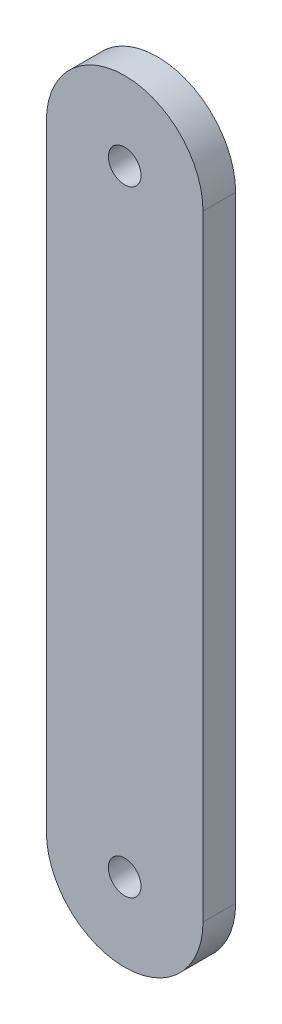
ISO-10303-21;
HEADER;
FILE_DESCRIPTION(('STEP AP214'),'2;1');
FILE_NAME('part.step','',(''),(''),'','','');
FILE_SCHEMA(('AUTOMOTIVE_DESIGN { 1 0 10303 214 1 1 1 1 }'));
ENDSEC;
DATA;
#1=APPLICATION_CONTEXT('core data for automotive mechanical design processes');
#2=APPLICATION_PROTOCOL_DEFINITION('international standard','automotive_design',2000,#1);
#3=PRODUCT_CONTEXT('',#1,'mechanical');
#4=PRODUCT('Part','Part','',(#3));
#5=PRODUCT_RELATED_PRODUCT_CATEGORY('part','',(#4));
#6=PRODUCT_DEFINITION_FORMATION('','',#4);
#7=PRODUCT_DEFINITION_CONTEXT('part definition',#1,'design');
#8=PRODUCT_DEFINITION('design','',#6,#7);
#9=PRODUCT_DEFINITION_SHAPE('','',#8);
#10=(LENGTH_UNIT() NAMED_UNIT(*) SI_UNIT(.MILLI.,.METRE.));
#11=(NAMED_UNIT(*) PLANE_ANGLE_UNIT() SI_UNIT($,.RADIAN.));
#12=(NAMED_UNIT(*) SI_UNIT($,.STERADIAN.) SOLID_ANGLE_UNIT());
#13=UNCERTAINTY_MEASURE_WITH_UNIT(LENGTH_MEASURE(1.E-05),#10,'distance_accuracy_value','');
#14=(GEOMETRIC_REPRESENTATION_CONTEXT(3) GLOBAL_UNCERTAINTY_ASSIGNED_CONTEXT((#13)) GLOBAL_UNIT_ASSIGNED_CONTEXT((#10,
#11,#12)) REPRESENTATION_CONTEXT('',''));
#15=CARTESIAN_POINT('',(0.,0.,0.));
#16=DIRECTION('',(0.,0.,1.));
#17=DIRECTION('',(1.,0.,0.));
#18=AXIS2_PLACEMENT_3D('',#15,#16,#17);
#19=CARTESIAN_POINT('',(0.,-47.1600000000001,0.));
#20=DIRECTION('',(0.,0.,1.));
#21=DIRECTION('',(1.,0.,0.));
#22=AXIS2_PLACEMENT_3D('',#19,#20,#21);
#23=CYLINDRICAL_SURFACE('',#22,12.);
#24=CARTESIAN_POINT('',(0.,-47.1600000000001,5.));
#25=DIRECTION('',(0.,0.,1.));
#26=DIRECTION('',(1.,0.,0.));
#27=AXIS2_PLACEMENT_3D('',#24,#25,#26);
#28=CIRCLE('',#27,12.);
#29=CARTESIAN_POINT('',(-12.,-47.1600000000001,5.));
#30=VERTEX_POINT('',#29);
#31=CARTESIAN_POINT('',(12.,-47.1600000000001,5.));
#32=VERTEX_POINT('',#31);
#33=EDGE_CURVE('E110',#30,#32,#28,.T.);
#34=ORIENTED_EDGE('',*,*,#33,.F.);
#35=DIRECTION('',(0.,0.,1.));
#36=VECTOR('',#35,1.);
#37=CARTESIAN_POINT('',(-12.,-47.1600000000001,0.));
#38=LINE('',#37,#36);
#39=CARTESIAN_POINT('',(-12.,-47.1600000000001,0.));
#40=VERTEX_POINT('',#39);
#41=EDGE_CURVE('E11',#40,#30,#38,.T.);
#42=ORIENTED_EDGE('',*,*,#41,.F.);
#43=CARTESIAN_POINT('',(0.,-47.1600000000001,0.));
#44=DIRECTION('',(0.,0.,1.));
#45=DIRECTION('',(1.,0.,0.));
#46=AXIS2_PLACEMENT_3D('',#43,#44,#45);
#47=CIRCLE('',#46,12.);
#48=CARTESIAN_POINT('',(12.,-47.1600000000001,0.));
#49=VERTEX_POINT('',#48);
#50=EDGE_CURVE('E101',#40,#49,#47,.T.);
#51=ORIENTED_EDGE('',*,*,#50,.T.);
#52=DIRECTION('',(0.,0.,1.));
#53=VECTOR('',#52,1.);
#54=CARTESIAN_POINT('',(12.,-47.1600000000001,0.));
#55=LINE('',#54,#53);
#56=EDGE_CURVE('E42',#49,#32,#55,.T.);
#57=ORIENTED_EDGE('',*,*,#56,.T.);
#58=EDGE_LOOP('',(#34,#42,#51,#57));
#59=FACE_BOUND('',#58,.T.);
#60=ADVANCED_FACE('F39',(#59),#23,.T.);
#61=CARTESIAN_POINT('',(-12.,47.1600000000001,0.));
#62=DIRECTION('',(-1.,0.,0.));
#63=DIRECTION('',(0.,0.,1.));
#64=AXIS2_PLACEMENT_3D('',#61,#62,#63);
#65=PLANE('',#64);
#66=DIRECTION('',(0.,-1.,0.));
#67=VECTOR('',#66,1.);
#68=CARTESIAN_POINT('',(-12.,47.1600000000001,5.));
#69=LINE('',#68,#67);
#70=CARTESIAN_POINT('',(-12.,47.1600000000001,5.));
#71=VERTEX_POINT('',#70);
#72=EDGE_CURVE('E104',#71,#30,#69,.T.);
#73=ORIENTED_EDGE('',*,*,#72,.F.);
#74=DIRECTION('',(0.,0.,1.));
#75=VECTOR('',#74,1.);
#76=CARTESIAN_POINT('',(-12.,47.1600000000001,0.));
#77=LINE('',#76,#75);
#78=CARTESIAN_POINT('',(-12.,47.1600000000001,0.));
#79=VERTEX_POINT('',#78);
#80=EDGE_CURVE('E49',#79,#71,#77,.T.);
#81=ORIENTED_EDGE('',*,*,#80,.F.);
#82=DIRECTION('',(0.,-1.,0.));
#83=VECTOR('',#82,1.);
#84=CARTESIAN_POINT('',(-12.,47.1600000000001,0.));
#85=LINE('',#84,#83);
#86=EDGE_CURVE('E96',#79,#40,#85,.T.);
#87=ORIENTED_EDGE('',*,*,#86,.T.);
#88=ORIENTED_EDGE('',*,*,#41,.T.);
#89=EDGE_LOOP('',(#73,#81,#87,#88));
#90=FACE_BOUND('',#89,.T.);
#91=ADVANCED_FACE('F127',(#90),#65,.T.);
#92=CARTESIAN_POINT('',(0.,47.1600000000001,0.));
#93=DIRECTION('',(0.,0.,1.));
#94=DIRECTION('',(1.,0.,0.));
#95=AXIS2_PLACEMENT_3D('',#92,#93,#94);
#96=CYLINDRICAL_SURFACE('',#95,12.);
#97=CARTESIAN_POINT('',(0.,47.1600000000001,5.));
#98=DIRECTION('',(0.,0.,1.));
#99=DIRECTION('',(1.,0.,0.));
#100=AXIS2_PLACEMENT_3D('',#97,#98,#99);
#101=CIRCLE('',#100,12.);
#102=CARTESIAN_POINT('',(12.,47.1600000000001,5.));
#103=VERTEX_POINT('',#102);
#104=EDGE_CURVE('E90',#103,#71,#101,.T.);
#105=ORIENTED_EDGE('',*,*,#104,.F.);
#106=DIRECTION('',(0.,0.,1.));
#107=VECTOR('',#106,1.);
#108=CARTESIAN_POINT('',(12.,47.1600000000001,0.));
#109=LINE('',#108,#107);
#110=CARTESIAN_POINT('',(12.,47.1600000000001,0.));
#111=VERTEX_POINT('',#110);
#112=EDGE_CURVE('E85',#111,#103,#109,.T.);
#113=ORIENTED_EDGE('',*,*,#112,.F.);
#114=CARTESIAN_POINT('',(0.,47.1600000000001,0.));
#115=DIRECTION('',(0.,0.,1.));
#116=DIRECTION('',(1.,0.,0.));
#117=AXIS2_PLACEMENT_3D('',#114,#115,#116);
#118=CIRCLE('',#117,12.);
#119=EDGE_CURVE('E88',#111,#79,#118,.T.);
#120=ORIENTED_EDGE('',*,*,#119,.T.);
#121=ORIENTED_EDGE('',*,*,#80,.T.);
#122=EDGE_LOOP('',(#105,#113,#120,#121));
#123=FACE_BOUND('',#122,.T.);
#124=ADVANCED_FACE('F87',(#123),#96,.T.);
#125=CARTESIAN_POINT('',(12.,-47.1600000000001,0.));
#126=DIRECTION('',(1.,0.,0.));
#127=DIRECTION('',(0.,1.,0.));
#128=AXIS2_PLACEMENT_3D('',#125,#126,#127);
#129=PLANE('',#128);
#130=DIRECTION('',(0.,1.,0.));
#131=VECTOR('',#130,1.);
#132=CARTESIAN_POINT('',(12.,-47.1600000000001,5.));
#133=LINE('',#132,#131);
#134=EDGE_CURVE('E114',#32,#103,#133,.T.);
#135=ORIENTED_EDGE('',*,*,#134,.F.);
#136=ORIENTED_EDGE('',*,*,#56,.F.);
#137=DIRECTION('',(0.,1.,0.));
#138=VECTOR('',#137,1.);
#139=CARTESIAN_POINT('',(12.,-47.1600000000001,0.));
#140=LINE('',#139,#138);
#141=EDGE_CURVE('E95',#49,#111,#140,.T.);
#142=ORIENTED_EDGE('',*,*,#141,.T.);
#143=ORIENTED_EDGE('',*,*,#112,.T.);
#144=EDGE_LOOP('',(#135,#136,#142,#143));
#145=FACE_BOUND('',#144,.T.);
#146=ADVANCED_FACE('F99',(#145),#129,.T.);
#147=CARTESIAN_POINT('',(0.,-47.1600000000001,0.));
#148=DIRECTION('',(0.,0.,1.));
#149=DIRECTION('',(1.,0.,0.));
#150=AXIS2_PLACEMENT_3D('',#147,#148,#149);
#151=PLANE('',#150);
#152=CARTESIAN_POINT('',(0.,47.1600000000001,0.));
#153=DIRECTION('',(0.,0.,1.));
#154=DIRECTION('',(-1.,0.,0.));
#155=AXIS2_PLACEMENT_3D('',#152,#153,#154);
#156=CIRCLE('',#155,2.5);
#157=CARTESIAN_POINT('',(-2.5,47.1600000000001,0.));
#158=VERTEX_POINT('',#157);
#159=EDGE_CURVE('E160',#158,#158,#156,.T.);
#160=ORIENTED_EDGE('',*,*,#159,.T.);
#161=EDGE_LOOP('',(#160));
#162=FACE_BOUND('',#161,.T.);
#163=CARTESIAN_POINT('',(0.,-47.1600000000001,0.));
#164=DIRECTION('',(0.,0.,1.));
#165=DIRECTION('',(-1.,0.,0.));
#166=AXIS2_PLACEMENT_3D('',#163,#164,#165);
#167=CIRCLE('',#166,2.5);
#168=CARTESIAN_POINT('',(-2.5,-47.1600000000001,0.));
#169=VERTEX_POINT('',#168);
#170=EDGE_CURVE('E115',#169,#169,#167,.T.);
#171=ORIENTED_EDGE('',*,*,#170,.T.);
#172=EDGE_LOOP('',(#171));
#173=FACE_BOUND('',#172,.T.);
#174=ORIENTED_EDGE('',*,*,#50,.F.);
#175=ORIENTED_EDGE('',*,*,#86,.F.);
#176=ORIENTED_EDGE('',*,*,#119,.F.);
#177=ORIENTED_EDGE('',*,*,#141,.F.);
#178=EDGE_LOOP('',(#174,#175,#176,#177));
#179=FACE_BOUND('',#178,.T.);
#180=ADVANCED_FACE('F94',(#162,#173,#179),#151,.F.);
#181=CARTESIAN_POINT('',(0.,-47.1600000000001,5.));
#182=DIRECTION('',(0.,0.,1.));
#183=DIRECTION('',(1.,0.,0.));
#184=AXIS2_PLACEMENT_3D('',#181,#182,#183);
#185=PLANE('',#184);
#186=CARTESIAN_POINT('',(0.,47.1600000000001,5.));
#187=DIRECTION('',(0.,0.,1.));
#188=DIRECTION('',(-1.,0.,0.));
#189=AXIS2_PLACEMENT_3D('',#186,#187,#188);
#190=CIRCLE('',#189,2.5);
#191=CARTESIAN_POINT('',(-2.5,47.1600000000001,5.));
#192=VERTEX_POINT('',#191);
#193=EDGE_CURVE('E163',#192,#192,#190,.T.);
#194=ORIENTED_EDGE('',*,*,#193,.F.);
#195=EDGE_LOOP('',(#194));
#196=FACE_BOUND('',#195,.T.);
#197=CARTESIAN_POINT('',(0.,-47.1600000000001,5.));
#198=DIRECTION('',(0.,0.,1.));
#199=DIRECTION('',(-1.,0.,0.));
#200=AXIS2_PLACEMENT_3D('',#197,#198,#199);
#201=CIRCLE('',#200,2.5);
#202=CARTESIAN_POINT('',(-2.5,-47.1600000000001,5.));
#203=VERTEX_POINT('',#202);
#204=EDGE_CURVE('E167',#203,#203,#201,.T.);
#205=ORIENTED_EDGE('',*,*,#204,.F.);
#206=EDGE_LOOP('',(#205));
#207=FACE_BOUND('',#206,.T.);
#208=ORIENTED_EDGE('',*,*,#33,.T.);
#209=ORIENTED_EDGE('',*,*,#134,.T.);
#210=ORIENTED_EDGE('',*,*,#104,.T.);
#211=ORIENTED_EDGE('',*,*,#72,.T.);
#212=EDGE_LOOP('',(#208,#209,#210,#211));
#213=FACE_BOUND('',#212,.T.);
#214=ADVANCED_FACE('F126',(#196,#207,#213),#185,.T.);
#215=CARTESIAN_POINT('',(0.,-47.1600000000001,0.));
#216=DIRECTION('',(0.,0.,1.));
#217=DIRECTION('',(1.,0.,0.));
#218=AXIS2_PLACEMENT_3D('',#215,#216,#217);
#219=CYLINDRICAL_SURFACE('',#218,2.5);
#220=ORIENTED_EDGE('',*,*,#170,.F.);
#221=EDGE_LOOP('',(#220));
#222=FACE_BOUND('',#221,.T.);
#223=ORIENTED_EDGE('',*,*,#204,.T.);
#224=EDGE_LOOP('',(#223));
#225=FACE_BOUND('',#224,.T.);
#226=ADVANCED_FACE('F145',(#222,#225),#219,.F.);
#227=CARTESIAN_POINT('',(0.,47.1600000000001,0.));
#228=DIRECTION('',(0.,0.,1.));
#229=DIRECTION('',(1.,0.,0.));
#230=AXIS2_PLACEMENT_3D('',#227,#228,#229);
#231=CYLINDRICAL_SURFACE('',#230,2.5);
#232=ORIENTED_EDGE('',*,*,#159,.F.);
#233=EDGE_LOOP('',(#232));
#234=FACE_BOUND('',#233,.T.);
#235=ORIENTED_EDGE('',*,*,#193,.T.);
#236=EDGE_LOOP('',(#235));
#237=FACE_BOUND('',#236,.T.);
#238=ADVANCED_FACE('F152',(#234,#237),#231,.F.);
#239=CLOSED_SHELL('',(#60,#91,#124,#146,#180,#214,#226,#238));
#240=MANIFOLD_SOLID_BREP('B2',#239);
#241=ADVANCED_BREP_SHAPE_REPRESENTATION('',(#18,#240),#14);
#242=SHAPE_DEFINITION_REPRESENTATION(#9,#241);
ENDSEC;
END-ISO-10303-21;
